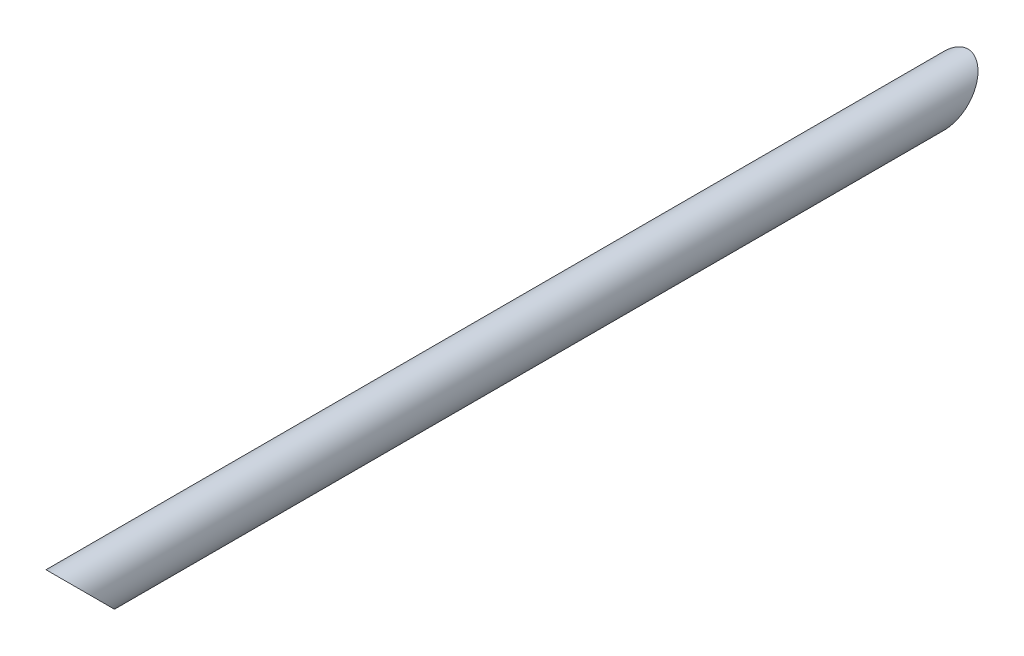
ISO-10303-21;
HEADER;
FILE_DESCRIPTION(('STEP AP214'),'2;1');
FILE_NAME('part.step','',(''),(''),'','','');
FILE_SCHEMA(('AUTOMOTIVE_DESIGN { 1 0 10303 214 1 1 1 1 }'));
ENDSEC;
DATA;
#1=APPLICATION_CONTEXT('core data for automotive mechanical design processes');
#2=APPLICATION_PROTOCOL_DEFINITION('international standard','automotive_design',2000,#1);
#3=PRODUCT_CONTEXT('',#1,'mechanical');
#4=PRODUCT('Part','Part','',(#3));
#5=PRODUCT_RELATED_PRODUCT_CATEGORY('part','',(#4));
#6=PRODUCT_DEFINITION_FORMATION('','',#4);
#7=PRODUCT_DEFINITION_CONTEXT('part definition',#1,'design');
#8=PRODUCT_DEFINITION('design','',#6,#7);
#9=PRODUCT_DEFINITION_SHAPE('','',#8);
#10=(LENGTH_UNIT() NAMED_UNIT(*) SI_UNIT(.MILLI.,.METRE.));
#11=(NAMED_UNIT(*) PLANE_ANGLE_UNIT() SI_UNIT($,.RADIAN.));
#12=(NAMED_UNIT(*) SI_UNIT($,.STERADIAN.) SOLID_ANGLE_UNIT());
#13=UNCERTAINTY_MEASURE_WITH_UNIT(LENGTH_MEASURE(1.E-05),#10,'distance_accuracy_value','');
#14=(GEOMETRIC_REPRESENTATION_CONTEXT(3) GLOBAL_UNCERTAINTY_ASSIGNED_CONTEXT((#13)) GLOBAL_UNIT_ASSIGNED_CONTEXT((#10,
#11,#12)) REPRESENTATION_CONTEXT('',''));
#15=CARTESIAN_POINT('',(0.,0.,0.));
#16=DIRECTION('',(0.,0.,1.));
#17=DIRECTION('',(1.,0.,0.));
#18=AXIS2_PLACEMENT_3D('',#15,#16,#17);
#19=CARTESIAN_POINT('',(0.,0.,0.));
#20=DIRECTION('',(0.,0.707106781186547,0.707106781186548));
#21=DIRECTION('',(0.,-0.707106781186548,0.707106781186547));
#22=AXIS2_PLACEMENT_3D('',#19,#20,#21);
#23=PLANE('',#22);
#24=CARTESIAN_POINT('',(0.,0.,0.));
#25=DIRECTION('',(0.,0.707106781186547,0.707106781186548));
#26=DIRECTION('',(0.,-0.707106781186548,0.707106781186547));
#27=AXIS2_PLACEMENT_3D('',#24,#25,#26);
#28=ELLIPSE('',#27,26.9407683632075,19.05);
#29=CARTESIAN_POINT('',(0.,-19.05,19.05));
#30=VERTEX_POINT('',#29);
#31=EDGE_CURVE('E9',#30,#30,#28,.T.);
#32=ORIENTED_EDGE('',*,*,#31,.F.);
#33=EDGE_LOOP('',(#32));
#34=FACE_BOUND('',#33,.T.);
#35=ADVANCED_FACE('F14',(#34),#23,.F.);
#36=CARTESIAN_POINT('',(0.,-339.725,339.725));
#37=DIRECTION('',(0.,0.707106781186547,-0.707106781186548));
#38=DIRECTION('',(0.,0.707106781186548,0.707106781186547));
#39=AXIS2_PLACEMENT_3D('',#36,#37,#38);
#40=PLANE('',#39);
#41=CARTESIAN_POINT('',(0.,0.,679.45));
#42=DIRECTION('',(0.,0.707106781186548,-0.707106781186548));
#43=DIRECTION('',(0.,-0.707106781186548,-0.707106781186548));
#44=AXIS2_PLACEMENT_3D('',#41,#42,#43);
#45=ELLIPSE('',#44,26.9407683632075,19.05);
#46=CARTESIAN_POINT('',(0.,-19.05,660.4));
#47=VERTEX_POINT('',#46);
#48=EDGE_CURVE('E18',#47,#47,#45,.T.);
#49=ORIENTED_EDGE('',*,*,#48,.F.);
#50=EDGE_LOOP('',(#49));
#51=FACE_BOUND('',#50,.T.);
#52=ADVANCED_FACE('F28',(#51),#40,.F.);
#53=CARTESIAN_POINT('',(0.,0.,0.));
#54=DIRECTION('',(0.,0.,1.));
#55=DIRECTION('',(1.,0.,0.));
#56=AXIS2_PLACEMENT_3D('',#53,#54,#55);
#57=CYLINDRICAL_SURFACE('',#56,19.05);
#58=ORIENTED_EDGE('',*,*,#31,.T.);
#59=EDGE_LOOP('',(#58));
#60=FACE_BOUND('',#59,.T.);
#61=ORIENTED_EDGE('',*,*,#48,.T.);
#62=EDGE_LOOP('',(#61));
#63=FACE_BOUND('',#62,.T.);
#64=ADVANCED_FACE('F16',(#60,#63),#57,.T.);
#65=CLOSED_SHELL('',(#35,#52,#64));
#66=MANIFOLD_SOLID_BREP('B1',#65);
#67=ADVANCED_BREP_SHAPE_REPRESENTATION('',(#18,#66),#14);
#68=SHAPE_DEFINITION_REPRESENTATION(#9,#67);
ENDSEC;
END-ISO-10303-21;
